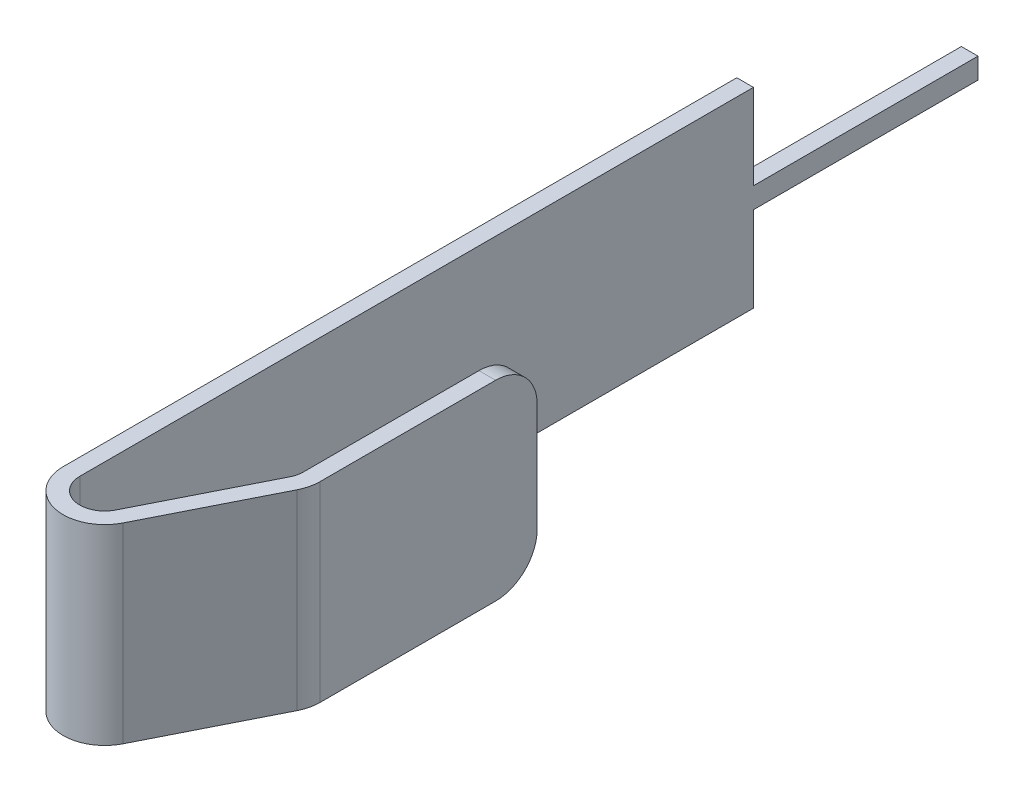
ISO-10303-21;
HEADER;
FILE_DESCRIPTION(('STEP AP214'),'2;1');
FILE_NAME('part.step','',(''),(''),'','','');
FILE_SCHEMA(('AUTOMOTIVE_DESIGN { 1 0 10303 214 1 1 1 1 }'));
ENDSEC;
DATA;
#1=APPLICATION_CONTEXT('core data for automotive mechanical design processes');
#2=APPLICATION_PROTOCOL_DEFINITION('international standard','automotive_design',2000,#1);
#3=PRODUCT_CONTEXT('',#1,'mechanical');
#4=PRODUCT('Part','Part','',(#3));
#5=PRODUCT_RELATED_PRODUCT_CATEGORY('part','',(#4));
#6=PRODUCT_DEFINITION_FORMATION('','',#4);
#7=PRODUCT_DEFINITION_CONTEXT('part definition',#1,'design');
#8=PRODUCT_DEFINITION('design','',#6,#7);
#9=PRODUCT_DEFINITION_SHAPE('','',#8);
#10=(LENGTH_UNIT() NAMED_UNIT(*) SI_UNIT(.MILLI.,.METRE.));
#11=(NAMED_UNIT(*) PLANE_ANGLE_UNIT() SI_UNIT($,.RADIAN.));
#12=(NAMED_UNIT(*) SI_UNIT($,.STERADIAN.) SOLID_ANGLE_UNIT());
#13=UNCERTAINTY_MEASURE_WITH_UNIT(LENGTH_MEASURE(1.E-05),#10,'distance_accuracy_value','');
#14=(GEOMETRIC_REPRESENTATION_CONTEXT(3) GLOBAL_UNCERTAINTY_ASSIGNED_CONTEXT((#13)) GLOBAL_UNIT_ASSIGNED_CONTEXT((#10,
#11,#12)) REPRESENTATION_CONTEXT('',''));
#15=CARTESIAN_POINT('',(0.,0.,0.));
#16=DIRECTION('',(0.,0.,1.));
#17=DIRECTION('',(1.,0.,0.));
#18=AXIS2_PLACEMENT_3D('',#15,#16,#17);
#19=CARTESIAN_POINT('',(0.,2.921,-6.858));
#20=DIRECTION('',(0.,0.,-1.));
#21=DIRECTION('',(-1.,0.,0.));
#22=AXIS2_PLACEMENT_3D('',#19,#20,#21);
#23=PLANE('',#22);
#24=DIRECTION('',(-1.,0.,0.));
#25=VECTOR('',#24,1.);
#26=CARTESIAN_POINT('',(4.31800000000001,-0.3175,-6.858));
#27=LINE('',#26,#25);
#28=CARTESIAN_POINT('',(0.508,-0.3175,-6.858));
#29=VERTEX_POINT('',#28);
#30=CARTESIAN_POINT('',(0.,-0.3175,-6.858));
#31=VERTEX_POINT('',#30);
#32=EDGE_CURVE('E354',#29,#31,#27,.T.);
#33=ORIENTED_EDGE('',*,*,#32,.T.);
#34=DIRECTION('',(0.,-1.,0.));
#35=VECTOR('',#34,1.);
#36=CARTESIAN_POINT('',(0.,2.921,-6.858));
#37=LINE('',#36,#35);
#38=CARTESIAN_POINT('',(0.,0.3175,-6.858));
#39=VERTEX_POINT('',#38);
#40=EDGE_CURVE('E236',#39,#31,#37,.T.);
#41=ORIENTED_EDGE('',*,*,#40,.F.);
#42=DIRECTION('',(-1.,0.,0.));
#43=VECTOR('',#42,1.);
#44=CARTESIAN_POINT('',(4.31800000000001,0.3175,-6.858));
#45=LINE('',#44,#43);
#46=CARTESIAN_POINT('',(0.508,0.3175,-6.858));
#47=VERTEX_POINT('',#46);
#48=EDGE_CURVE('E271',#47,#39,#45,.T.);
#49=ORIENTED_EDGE('',*,*,#48,.F.);
#50=DIRECTION('',(0.,-1.,0.));
#51=VECTOR('',#50,1.);
#52=CARTESIAN_POINT('',(0.508,2.921,-6.858));
#53=LINE('',#52,#51);
#54=EDGE_CURVE('E238',#47,#29,#53,.T.);
#55=ORIENTED_EDGE('',*,*,#54,.T.);
#56=EDGE_LOOP('',(#33,#41,#49,#55));
#57=FACE_BOUND('',#56,.T.);
#58=ADVANCED_FACE('F35',(#57),#23,.T.);
#59=CARTESIAN_POINT('',(0.,2.921,0.));
#60=DIRECTION('',(-1.,0.,0.));
#61=DIRECTION('',(0.,0.,1.));
#62=AXIS2_PLACEMENT_3D('',#59,#60,#61);
#63=PLANE('',#62);
#64=DIRECTION('',(0.,0.,-1.));
#65=VECTOR('',#64,1.);
#66=CARTESIAN_POINT('',(0.,-0.3175,-6.858));
#67=LINE('',#66,#65);
#68=CARTESIAN_POINT('',(0.,-0.3175,0.));
#69=VERTEX_POINT('',#68);
#70=EDGE_CURVE('E175',#69,#31,#67,.T.);
#71=ORIENTED_EDGE('',*,*,#70,.F.);
#72=DIRECTION('',(0.,1.,0.));
#73=VECTOR('',#72,1.);
#74=CARTESIAN_POINT('',(0.,-2.921,0.));
#75=LINE('',#74,#73);
#76=CARTESIAN_POINT('',(0.,-2.921,0.));
#77=VERTEX_POINT('',#76);
#78=EDGE_CURVE('E161',#77,#69,#75,.T.);
#79=ORIENTED_EDGE('',*,*,#78,.F.);
#80=DIRECTION('',(0.,0.,-1.));
#81=VECTOR('',#80,1.);
#82=CARTESIAN_POINT('',(0.,-2.921,0.));
#83=LINE('',#82,#81);
#84=CARTESIAN_POINT('',(0.,-2.921,20.574));
#85=VERTEX_POINT('',#84);
#86=EDGE_CURVE('E172',#85,#77,#83,.T.);
#87=ORIENTED_EDGE('',*,*,#86,.F.);
#88=DIRECTION('',(0.,-1.,0.));
#89=VECTOR('',#88,1.);
#90=CARTESIAN_POINT('',(0.,2.921,20.574));
#91=LINE('',#90,#89);
#92=CARTESIAN_POINT('',(0.,2.921,20.574));
#93=VERTEX_POINT('',#92);
#94=EDGE_CURVE('E234',#93,#85,#91,.T.);
#95=ORIENTED_EDGE('',*,*,#94,.F.);
#96=DIRECTION('',(0.,0.,-1.));
#97=VECTOR('',#96,1.);
#98=CARTESIAN_POINT('',(0.,2.921,0.));
#99=LINE('',#98,#97);
#100=CARTESIAN_POINT('',(0.,2.921,0.));
#101=VERTEX_POINT('',#100);
#102=EDGE_CURVE('E282',#93,#101,#99,.T.);
#103=ORIENTED_EDGE('',*,*,#102,.T.);
#104=DIRECTION('',(0.,1.,0.));
#105=VECTOR('',#104,1.);
#106=CARTESIAN_POINT('',(0.,2.921,0.));
#107=LINE('',#106,#105);
#108=CARTESIAN_POINT('',(0.,0.3175,0.));
#109=VERTEX_POINT('',#108);
#110=EDGE_CURVE('E58',#109,#101,#107,.T.);
#111=ORIENTED_EDGE('',*,*,#110,.F.);
#112=DIRECTION('',(0.,0.,1.));
#113=VECTOR('',#112,1.);
#114=CARTESIAN_POINT('',(0.,0.3175,-6.858));
#115=LINE('',#114,#113);
#116=EDGE_CURVE('E278',#39,#109,#115,.T.);
#117=ORIENTED_EDGE('',*,*,#116,.F.);
#118=ORIENTED_EDGE('',*,*,#40,.T.);
#119=EDGE_LOOP('',(#71,#79,#87,#95,#103,#111,#117,#118));
#120=FACE_BOUND('',#119,.T.);
#121=ADVANCED_FACE('F170',(#120),#63,.T.);
#122=CARTESIAN_POINT('',(1.27,2.921,20.574));
#123=DIRECTION('',(0.,-1.,0.));
#124=DIRECTION('',(0.,0.,-1.));
#125=AXIS2_PLACEMENT_3D('',#122,#123,#124);
#126=CYLINDRICAL_SURFACE('',#125,1.27);
#127=CARTESIAN_POINT('',(1.27,-2.921,20.574));
#128=DIRECTION('',(0.,-1.,0.));
#129=DIRECTION('',(0.,0.,-1.));
#130=AXIS2_PLACEMENT_3D('',#127,#128,#129);
#131=CIRCLE('',#130,1.27);
#132=CARTESIAN_POINT('',(2.40437020869445,-2.921,21.1450553647647));
#133=VERTEX_POINT('',#132);
#134=EDGE_CURVE('E180',#133,#85,#131,.T.);
#135=ORIENTED_EDGE('',*,*,#134,.F.);
#136=DIRECTION('',(0.,-1.,0.));
#137=VECTOR('',#136,1.);
#138=CARTESIAN_POINT('',(2.40437020869445,2.921,21.1450553647647));
#139=LINE('',#138,#137);
#140=CARTESIAN_POINT('',(2.40437020869445,2.921,21.1450553647647));
#141=VERTEX_POINT('',#140);
#142=EDGE_CURVE('E232',#141,#133,#139,.T.);
#143=ORIENTED_EDGE('',*,*,#142,.F.);
#144=CARTESIAN_POINT('',(1.27,2.921,20.574));
#145=DIRECTION('',(0.,-1.,0.));
#146=DIRECTION('',(0.,0.,-1.));
#147=AXIS2_PLACEMENT_3D('',#144,#145,#146);
#148=CIRCLE('',#147,1.27);
#149=EDGE_CURVE('E285',#141,#93,#148,.T.);
#150=ORIENTED_EDGE('',*,*,#149,.T.);
#151=ORIENTED_EDGE('',*,*,#94,.T.);
#152=EDGE_LOOP('',(#135,#143,#150,#151));
#153=FACE_BOUND('',#152,.T.);
#154=ADVANCED_FACE('F351',(#153),#126,.T.);
#155=CARTESIAN_POINT('',(2.40437020869445,2.921,21.1450553647647));
#156=DIRECTION('',(0.893204888735784,0.,0.449649893515495));
#157=DIRECTION('',(0.449649893515495,0.,-0.893204888735784));
#158=AXIS2_PLACEMENT_3D('',#155,#156,#157);
#159=PLANE('',#158);
#160=DIRECTION('',(-0.449649893515495,0.,0.893204888735784));
#161=VECTOR('',#160,1.);
#162=CARTESIAN_POINT('',(2.40437020869445,-2.921,21.1450553647647));
#163=LINE('',#162,#161);
#164=CARTESIAN_POINT('',(4.18237020869445,-2.921,17.6131557355757));
#165=VERTEX_POINT('',#164);
#166=EDGE_CURVE('E183',#165,#133,#163,.T.);
#167=ORIENTED_EDGE('',*,*,#166,.F.);
#168=DIRECTION('',(0.,-1.,0.));
#169=VECTOR('',#168,1.);
#170=CARTESIAN_POINT('',(4.18237020869445,2.921,17.6131557355757));
#171=LINE('',#170,#169);
#172=CARTESIAN_POINT('',(4.18237020869445,2.921,17.6131557355757));
#173=VERTEX_POINT('',#172);
#174=EDGE_CURVE('E230',#173,#165,#171,.T.);
#175=ORIENTED_EDGE('',*,*,#174,.F.);
#176=DIRECTION('',(-0.449649893515495,0.,0.893204888735784));
#177=VECTOR('',#176,1.);
#178=CARTESIAN_POINT('',(2.40437020869445,2.921,21.1450553647647));
#179=LINE('',#178,#177);
#180=EDGE_CURVE('E288',#173,#141,#179,.T.);
#181=ORIENTED_EDGE('',*,*,#180,.T.);
#182=ORIENTED_EDGE('',*,*,#142,.T.);
#183=EDGE_LOOP('',(#167,#175,#181,#182));
#184=FACE_BOUND('',#183,.T.);
#185=ADVANCED_FACE('F349',(#184),#159,.T.);
#186=CARTESIAN_POINT('',(3.04800000000001,2.921,17.0421003708111));
#187=DIRECTION('',(0.,-1.,0.));
#188=DIRECTION('',(0.,0.,-1.));
#189=AXIS2_PLACEMENT_3D('',#186,#187,#188);
#190=CYLINDRICAL_SURFACE('',#189,1.27);
#191=CARTESIAN_POINT('',(3.04800000000001,-2.921,17.0421003708111));
#192=DIRECTION('',(0.,-1.,0.));
#193=DIRECTION('',(0.,0.,-1.));
#194=AXIS2_PLACEMENT_3D('',#191,#192,#193);
#195=CIRCLE('',#194,1.27);
#196=CARTESIAN_POINT('',(4.31800000000001,-2.921,17.0421003708111));
#197=VERTEX_POINT('',#196);
#198=EDGE_CURVE('E193',#197,#165,#195,.T.);
#199=ORIENTED_EDGE('',*,*,#198,.F.);
#200=DIRECTION('',(0.,-1.,0.));
#201=VECTOR('',#200,1.);
#202=CARTESIAN_POINT('',(4.31800000000001,2.921,17.0421003708111));
#203=LINE('',#202,#201);
#204=CARTESIAN_POINT('',(4.31800000000001,2.921,17.0421003708111));
#205=VERTEX_POINT('',#204);
#206=EDGE_CURVE('E227',#205,#197,#203,.T.);
#207=ORIENTED_EDGE('',*,*,#206,.F.);
#208=CARTESIAN_POINT('',(3.04800000000001,2.921,17.0421003708111));
#209=DIRECTION('',(0.,-1.,0.));
#210=DIRECTION('',(0.,0.,-1.));
#211=AXIS2_PLACEMENT_3D('',#208,#209,#210);
#212=CIRCLE('',#211,1.27);
#213=EDGE_CURVE('E291',#205,#173,#212,.T.);
#214=ORIENTED_EDGE('',*,*,#213,.T.);
#215=ORIENTED_EDGE('',*,*,#174,.T.);
#216=EDGE_LOOP('',(#199,#207,#214,#215));
#217=FACE_BOUND('',#216,.T.);
#218=ADVANCED_FACE('F346',(#217),#190,.T.);
#219=CARTESIAN_POINT('',(4.31800000000001,2.921,17.0421003708111));
#220=DIRECTION('',(1.,0.,0.));
#221=DIRECTION('',(0.,0.,-1.));
#222=AXIS2_PLACEMENT_3D('',#219,#220,#221);
#223=PLANE('',#222);
#224=DIRECTION('',(0.,0.,1.));
#225=VECTOR('',#224,1.);
#226=CARTESIAN_POINT('',(4.31800000000001,-2.921,17.0421003708111));
#227=LINE('',#226,#225);
#228=CARTESIAN_POINT('',(4.31800000000001,-2.921,11.684));
#229=VERTEX_POINT('',#228);
#230=EDGE_CURVE('E196',#229,#197,#227,.T.);
#231=ORIENTED_EDGE('',*,*,#230,.F.);
#232=CARTESIAN_POINT('',(4.31800000000001,-1.651,11.684));
#233=DIRECTION('',(1.,0.,0.));
#234=DIRECTION('',(0.,0.,-1.));
#235=AXIS2_PLACEMENT_3D('',#232,#233,#234);
#236=CIRCLE('',#235,1.27);
#237=CARTESIAN_POINT('',(4.31800000000001,-1.651,10.414));
#238=VERTEX_POINT('',#237);
#239=EDGE_CURVE('E246',#229,#238,#236,.T.);
#240=ORIENTED_EDGE('',*,*,#239,.T.);
#241=DIRECTION('',(0.,-1.,0.));
#242=VECTOR('',#241,1.);
#243=CARTESIAN_POINT('',(4.31800000000001,2.921,10.414));
#244=LINE('',#243,#242);
#245=CARTESIAN_POINT('',(4.31800000000001,1.651,10.414));
#246=VERTEX_POINT('',#245);
#247=EDGE_CURVE('E224',#246,#238,#244,.T.);
#248=ORIENTED_EDGE('',*,*,#247,.F.);
#249=CARTESIAN_POINT('',(4.31800000000001,1.651,11.684));
#250=DIRECTION('',(1.,0.,0.));
#251=DIRECTION('',(0.,0.,-1.));
#252=AXIS2_PLACEMENT_3D('',#249,#250,#251);
#253=CIRCLE('',#252,1.27);
#254=CARTESIAN_POINT('',(4.31800000000001,2.921,11.684));
#255=VERTEX_POINT('',#254);
#256=EDGE_CURVE('E244',#246,#255,#253,.T.);
#257=ORIENTED_EDGE('',*,*,#256,.T.);
#258=DIRECTION('',(0.,0.,1.));
#259=VECTOR('',#258,1.);
#260=CARTESIAN_POINT('',(4.31800000000001,2.921,17.0421003708111));
#261=LINE('',#260,#259);
#262=EDGE_CURVE('E294',#255,#205,#261,.T.);
#263=ORIENTED_EDGE('',*,*,#262,.T.);
#264=ORIENTED_EDGE('',*,*,#206,.T.);
#265=EDGE_LOOP('',(#231,#240,#248,#257,#263,#264));
#266=FACE_BOUND('',#265,.T.);
#267=ADVANCED_FACE('F332',(#266),#223,.T.);
#268=CARTESIAN_POINT('',(3.81000000000001,2.921,10.414));
#269=DIRECTION('',(0.,0.,-1.));
#270=DIRECTION('',(-1.,0.,0.));
#271=AXIS2_PLACEMENT_3D('',#268,#269,#270);
#272=PLANE('',#271);
#273=ORIENTED_EDGE('',*,*,#247,.T.);
#274=DIRECTION('',(1.,0.,0.));
#275=VECTOR('',#274,1.);
#276=CARTESIAN_POINT('',(3.81000000000001,-1.651,10.414));
#277=LINE('',#276,#275);
#278=CARTESIAN_POINT('',(3.81000000000001,-1.651,10.414));
#279=VERTEX_POINT('',#278);
#280=EDGE_CURVE('E251',#238,#279,#277,.F.);
#281=ORIENTED_EDGE('',*,*,#280,.T.);
#282=DIRECTION('',(0.,-1.,0.));
#283=VECTOR('',#282,1.);
#284=CARTESIAN_POINT('',(3.81000000000001,2.921,10.414));
#285=LINE('',#284,#283);
#286=CARTESIAN_POINT('',(3.81000000000001,1.651,10.414));
#287=VERTEX_POINT('',#286);
#288=EDGE_CURVE('E221',#287,#279,#285,.T.);
#289=ORIENTED_EDGE('',*,*,#288,.F.);
#290=DIRECTION('',(1.,0.,0.));
#291=VECTOR('',#290,1.);
#292=CARTESIAN_POINT('',(4.31800000000001,1.651,10.414));
#293=LINE('',#292,#291);
#294=EDGE_CURVE('E248',#287,#246,#293,.T.);
#295=ORIENTED_EDGE('',*,*,#294,.T.);
#296=EDGE_LOOP('',(#273,#281,#289,#295));
#297=FACE_BOUND('',#296,.T.);
#298=ADVANCED_FACE('F334',(#297),#272,.T.);
#299=CARTESIAN_POINT('',(3.81000000000001,2.921,17.0421003708111));
#300=DIRECTION('',(1.,0.,0.));
#301=DIRECTION('',(0.,0.,-1.));
#302=AXIS2_PLACEMENT_3D('',#299,#300,#301);
#303=PLANE('',#302);
#304=ORIENTED_EDGE('',*,*,#288,.T.);
#305=CARTESIAN_POINT('',(3.81000000000001,-1.651,11.684));
#306=DIRECTION('',(1.,0.,0.));
#307=DIRECTION('',(0.,0.,-1.));
#308=AXIS2_PLACEMENT_3D('',#305,#306,#307);
#309=CIRCLE('',#308,1.27);
#310=CARTESIAN_POINT('',(3.81000000000001,-2.921,11.684));
#311=VERTEX_POINT('',#310);
#312=EDGE_CURVE('E255',#279,#311,#309,.F.);
#313=ORIENTED_EDGE('',*,*,#312,.T.);
#314=DIRECTION('',(0.,0.,-1.));
#315=VECTOR('',#314,1.);
#316=CARTESIAN_POINT('',(3.81000000000001,-2.921,17.0421003708111));
#317=LINE('',#316,#315);
#318=CARTESIAN_POINT('',(3.81000000000001,-2.921,17.0421003708111));
#319=VERTEX_POINT('',#318);
#320=EDGE_CURVE('E198',#311,#319,#317,.F.);
#321=ORIENTED_EDGE('',*,*,#320,.T.);
#322=DIRECTION('',(0.,-1.,0.));
#323=VECTOR('',#322,1.);
#324=CARTESIAN_POINT('',(3.81000000000001,2.921,17.0421003708111));
#325=LINE('',#324,#323);
#326=CARTESIAN_POINT('',(3.81000000000001,2.921,17.0421003708111));
#327=VERTEX_POINT('',#326);
#328=EDGE_CURVE('E218',#327,#319,#325,.T.);
#329=ORIENTED_EDGE('',*,*,#328,.F.);
#330=DIRECTION('',(0.,0.,-1.));
#331=VECTOR('',#330,1.);
#332=CARTESIAN_POINT('',(3.81000000000001,2.921,17.0421003708111));
#333=LINE('',#332,#331);
#334=CARTESIAN_POINT('',(3.81000000000001,2.921,11.684));
#335=VERTEX_POINT('',#334);
#336=EDGE_CURVE('E296',#335,#327,#333,.F.);
#337=ORIENTED_EDGE('',*,*,#336,.F.);
#338=CARTESIAN_POINT('',(3.81000000000001,1.651,11.684));
#339=DIRECTION('',(1.,0.,0.));
#340=DIRECTION('',(0.,0.,-1.));
#341=AXIS2_PLACEMENT_3D('',#338,#339,#340);
#342=CIRCLE('',#341,1.27);
#343=EDGE_CURVE('E253',#335,#287,#342,.F.);
#344=ORIENTED_EDGE('',*,*,#343,.T.);
#345=EDGE_LOOP('',(#304,#313,#321,#329,#337,#344));
#346=FACE_BOUND('',#345,.T.);
#347=ADVANCED_FACE('F322',(#346),#303,.F.);
#348=CARTESIAN_POINT('',(3.04800000000001,2.921,17.0421003708111));
#349=DIRECTION('',(0.,-1.,0.));
#350=DIRECTION('',(0.,0.,-1.));
#351=AXIS2_PLACEMENT_3D('',#348,#349,#350);
#352=CYLINDRICAL_SURFACE('',#351,0.761999999999999);
#353=CARTESIAN_POINT('',(3.04800000000001,-2.921,17.0421003708111));
#354=DIRECTION('',(0.,1.,0.));
#355=DIRECTION('',(1.,0.,0.));
#356=AXIS2_PLACEMENT_3D('',#353,#354,#355);
#357=CIRCLE('',#356,0.761999999999999);
#358=CARTESIAN_POINT('',(3.72862212521667,-2.921,17.3847335896699));
#359=VERTEX_POINT('',#358);
#360=EDGE_CURVE('E200',#319,#359,#357,.F.);
#361=ORIENTED_EDGE('',*,*,#360,.T.);
#362=DIRECTION('',(0.,-1.,0.));
#363=VECTOR('',#362,1.);
#364=CARTESIAN_POINT('',(3.72862212521667,2.921,17.3847335896699));
#365=LINE('',#364,#363);
#366=CARTESIAN_POINT('',(3.72862212521667,2.921,17.3847335896699));
#367=VERTEX_POINT('',#366);
#368=EDGE_CURVE('E215',#367,#359,#365,.T.);
#369=ORIENTED_EDGE('',*,*,#368,.F.);
#370=CARTESIAN_POINT('',(3.04800000000001,2.921,17.0421003708111));
#371=DIRECTION('',(0.,1.,0.));
#372=DIRECTION('',(1.,0.,0.));
#373=AXIS2_PLACEMENT_3D('',#370,#371,#372);
#374=CIRCLE('',#373,0.761999999999999);
#375=EDGE_CURVE('E298',#327,#367,#374,.F.);
#376=ORIENTED_EDGE('',*,*,#375,.F.);
#377=ORIENTED_EDGE('',*,*,#328,.T.);
#378=EDGE_LOOP('',(#361,#369,#376,#377));
#379=FACE_BOUND('',#378,.T.);
#380=ADVANCED_FACE('F318',(#379),#352,.F.);
#381=CARTESIAN_POINT('',(1.95062212521667,2.921,20.9166332188588));
#382=DIRECTION('',(0.893204888735784,0.,0.449649893515495));
#383=DIRECTION('',(0.449649893515495,0.,-0.893204888735784));
#384=AXIS2_PLACEMENT_3D('',#381,#382,#383);
#385=PLANE('',#384);
#386=DIRECTION('',(-0.449649893515495,0.,0.893204888735784));
#387=VECTOR('',#386,1.);
#388=CARTESIAN_POINT('',(1.95062212521667,-2.921,20.9166332188588));
#389=LINE('',#388,#387);
#390=CARTESIAN_POINT('',(1.95062212521667,-2.921,20.9166332188588));
#391=VERTEX_POINT('',#390);
#392=EDGE_CURVE('E202',#359,#391,#389,.T.);
#393=ORIENTED_EDGE('',*,*,#392,.T.);
#394=DIRECTION('',(0.,-1.,0.));
#395=VECTOR('',#394,1.);
#396=CARTESIAN_POINT('',(1.95062212521667,2.921,20.9166332188588));
#397=LINE('',#396,#395);
#398=CARTESIAN_POINT('',(1.95062212521667,2.921,20.9166332188588));
#399=VERTEX_POINT('',#398);
#400=EDGE_CURVE('E212',#399,#391,#397,.T.);
#401=ORIENTED_EDGE('',*,*,#400,.F.);
#402=DIRECTION('',(-0.449649893515495,0.,0.893204888735784));
#403=VECTOR('',#402,1.);
#404=CARTESIAN_POINT('',(1.95062212521667,2.921,20.9166332188588));
#405=LINE('',#404,#403);
#406=EDGE_CURVE('E299',#367,#399,#405,.T.);
#407=ORIENTED_EDGE('',*,*,#406,.F.);
#408=ORIENTED_EDGE('',*,*,#368,.T.);
#409=EDGE_LOOP('',(#393,#401,#407,#408));
#410=FACE_BOUND('',#409,.T.);
#411=ADVANCED_FACE('F314',(#410),#385,.F.);
#412=CARTESIAN_POINT('',(1.27,2.921,20.574));
#413=DIRECTION('',(0.,-1.,0.));
#414=DIRECTION('',(0.,0.,-1.));
#415=AXIS2_PLACEMENT_3D('',#412,#413,#414);
#416=CYLINDRICAL_SURFACE('',#415,0.762);
#417=CARTESIAN_POINT('',(1.27,-2.921,20.574));
#418=DIRECTION('',(0.,1.,0.));
#419=DIRECTION('',(1.,0.,0.));
#420=AXIS2_PLACEMENT_3D('',#417,#418,#419);
#421=CIRCLE('',#420,0.762);
#422=CARTESIAN_POINT('',(0.508000000000003,-2.921,20.574));
#423=VERTEX_POINT('',#422);
#424=EDGE_CURVE('E204',#391,#423,#421,.F.);
#425=ORIENTED_EDGE('',*,*,#424,.T.);
#426=DIRECTION('',(0.,-1.,0.));
#427=VECTOR('',#426,1.);
#428=CARTESIAN_POINT('',(0.508000000000003,2.921,20.574));
#429=LINE('',#428,#427);
#430=CARTESIAN_POINT('',(0.508000000000003,2.921,20.574));
#431=VERTEX_POINT('',#430);
#432=EDGE_CURVE('E209',#431,#423,#429,.T.);
#433=ORIENTED_EDGE('',*,*,#432,.F.);
#434=CARTESIAN_POINT('',(1.27,2.921,20.574));
#435=DIRECTION('',(0.,1.,0.));
#436=DIRECTION('',(1.,0.,0.));
#437=AXIS2_PLACEMENT_3D('',#434,#435,#436);
#438=CIRCLE('',#437,0.762);
#439=EDGE_CURVE('E189',#399,#431,#438,.F.);
#440=ORIENTED_EDGE('',*,*,#439,.F.);
#441=ORIENTED_EDGE('',*,*,#400,.T.);
#442=EDGE_LOOP('',(#425,#433,#440,#441));
#443=FACE_BOUND('',#442,.T.);
#444=ADVANCED_FACE('F308',(#443),#416,.F.);
#445=CARTESIAN_POINT('',(0.508,2.921,0.));
#446=DIRECTION('',(-1.,0.,0.));
#447=DIRECTION('',(0.,0.,1.));
#448=AXIS2_PLACEMENT_3D('',#445,#446,#447);
#449=PLANE('',#448);
#450=DIRECTION('',(0.,1.,0.));
#451=VECTOR('',#450,1.);
#452=CARTESIAN_POINT('',(0.508,2.921,0.));
#453=LINE('',#452,#451);
#454=CARTESIAN_POINT('',(0.508,-2.921,0.));
#455=VERTEX_POINT('',#454);
#456=CARTESIAN_POINT('',(0.508,-0.3175,0.));
#457=VERTEX_POINT('',#456);
#458=EDGE_CURVE('E50',#455,#457,#453,.T.);
#459=ORIENTED_EDGE('',*,*,#458,.T.);
#460=DIRECTION('',(0.,0.,-1.));
#461=VECTOR('',#460,1.);
#462=CARTESIAN_POINT('',(0.508,-0.3175,0.));
#463=LINE('',#462,#461);
#464=EDGE_CURVE('E11',#457,#29,#463,.T.);
#465=ORIENTED_EDGE('',*,*,#464,.T.);
#466=ORIENTED_EDGE('',*,*,#54,.F.);
#467=DIRECTION('',(0.,0.,1.));
#468=VECTOR('',#467,1.);
#469=CARTESIAN_POINT('',(0.508,0.3175,0.));
#470=LINE('',#469,#468);
#471=CARTESIAN_POINT('',(0.508,0.3175,0.));
#472=VERTEX_POINT('',#471);
#473=EDGE_CURVE('E167',#47,#472,#470,.T.);
#474=ORIENTED_EDGE('',*,*,#473,.T.);
#475=DIRECTION('',(0.,1.,0.));
#476=VECTOR('',#475,1.);
#477=CARTESIAN_POINT('',(0.508,2.921,0.));
#478=LINE('',#477,#476);
#479=CARTESIAN_POINT('',(0.508000000000002,2.921,0.));
#480=VERTEX_POINT('',#479);
#481=EDGE_CURVE('E181',#472,#480,#478,.T.);
#482=ORIENTED_EDGE('',*,*,#481,.T.);
#483=DIRECTION('',(0.,0.,-1.));
#484=VECTOR('',#483,1.);
#485=CARTESIAN_POINT('',(0.508,2.921,0.));
#486=LINE('',#485,#484);
#487=EDGE_CURVE('E208',#431,#480,#486,.T.);
#488=ORIENTED_EDGE('',*,*,#487,.F.);
#489=ORIENTED_EDGE('',*,*,#432,.T.);
#490=DIRECTION('',(0.,0.,-1.));
#491=VECTOR('',#490,1.);
#492=CARTESIAN_POINT('',(0.508,-2.921,0.));
#493=LINE('',#492,#491);
#494=EDGE_CURVE('E206',#423,#455,#493,.T.);
#495=ORIENTED_EDGE('',*,*,#494,.T.);
#496=EDGE_LOOP('',(#459,#465,#466,#474,#482,#488,#489,#495));
#497=FACE_BOUND('',#496,.T.);
#498=ADVANCED_FACE('F264',(#497),#449,.F.);
#499=CARTESIAN_POINT('',(1.27,2.921,20.574));
#500=DIRECTION('',(0.,-1.,0.));
#501=DIRECTION('',(-1.,0.,0.));
#502=AXIS2_PLACEMENT_3D('',#499,#500,#501);
#503=PLANE('',#502);
#504=ORIENTED_EDGE('',*,*,#487,.T.);
#505=DIRECTION('',(-1.,0.,0.));
#506=VECTOR('',#505,1.);
#507=CARTESIAN_POINT('',(1.27,2.921,0.));
#508=LINE('',#507,#506);
#509=EDGE_CURVE('E259',#480,#101,#508,.T.);
#510=ORIENTED_EDGE('',*,*,#509,.T.);
#511=ORIENTED_EDGE('',*,*,#102,.F.);
#512=ORIENTED_EDGE('',*,*,#149,.F.);
#513=ORIENTED_EDGE('',*,*,#180,.F.);
#514=ORIENTED_EDGE('',*,*,#213,.F.);
#515=ORIENTED_EDGE('',*,*,#262,.F.);
#516=DIRECTION('',(1.,0.,0.));
#517=VECTOR('',#516,1.);
#518=CARTESIAN_POINT('',(3.81000000000001,2.921,11.684));
#519=LINE('',#518,#517);
#520=EDGE_CURVE('E257',#255,#335,#519,.F.);
#521=ORIENTED_EDGE('',*,*,#520,.T.);
#522=ORIENTED_EDGE('',*,*,#336,.T.);
#523=ORIENTED_EDGE('',*,*,#375,.T.);
#524=ORIENTED_EDGE('',*,*,#406,.T.);
#525=ORIENTED_EDGE('',*,*,#439,.T.);
#526=EDGE_LOOP('',(#504,#510,#511,#512,#513,#514,#515,#521,#522,#523,#524,#525));
#527=FACE_BOUND('',#526,.T.);
#528=ADVANCED_FACE('F306',(#527),#503,.F.);
#529=CARTESIAN_POINT('',(1.27,-2.921,20.574));
#530=DIRECTION('',(0.,-1.,0.));
#531=DIRECTION('',(-1.,0.,0.));
#532=AXIS2_PLACEMENT_3D('',#529,#530,#531);
#533=PLANE('',#532);
#534=DIRECTION('',(-1.,0.,0.));
#535=VECTOR('',#534,1.);
#536=CARTESIAN_POINT('',(1.27,-2.921,0.));
#537=LINE('',#536,#535);
#538=EDGE_CURVE('E43',#455,#77,#537,.T.);
#539=ORIENTED_EDGE('',*,*,#538,.F.);
#540=ORIENTED_EDGE('',*,*,#494,.F.);
#541=ORIENTED_EDGE('',*,*,#424,.F.);
#542=ORIENTED_EDGE('',*,*,#392,.F.);
#543=ORIENTED_EDGE('',*,*,#360,.F.);
#544=ORIENTED_EDGE('',*,*,#320,.F.);
#545=DIRECTION('',(1.,0.,0.));
#546=VECTOR('',#545,1.);
#547=CARTESIAN_POINT('',(1.27,-2.921,11.684));
#548=LINE('',#547,#546);
#549=EDGE_CURVE('E241',#311,#229,#548,.T.);
#550=ORIENTED_EDGE('',*,*,#549,.T.);
#551=ORIENTED_EDGE('',*,*,#230,.T.);
#552=ORIENTED_EDGE('',*,*,#198,.T.);
#553=ORIENTED_EDGE('',*,*,#166,.T.);
#554=ORIENTED_EDGE('',*,*,#134,.T.);
#555=ORIENTED_EDGE('',*,*,#86,.T.);
#556=EDGE_LOOP('',(#539,#540,#541,#542,#543,#544,#550,#551,#552,#553,#554,#555));
#557=FACE_BOUND('',#556,.T.);
#558=ADVANCED_FACE('F177',(#557),#533,.T.);
#559=CARTESIAN_POINT('',(1.27,-1.651,11.684));
#560=DIRECTION('',(1.,0.,0.));
#561=DIRECTION('',(0.,0.,-1.));
#562=AXIS2_PLACEMENT_3D('',#559,#560,#561);
#563=CYLINDRICAL_SURFACE('',#562,1.27);
#564=ORIENTED_EDGE('',*,*,#312,.F.);
#565=ORIENTED_EDGE('',*,*,#280,.F.);
#566=ORIENTED_EDGE('',*,*,#239,.F.);
#567=ORIENTED_EDGE('',*,*,#549,.F.);
#568=EDGE_LOOP('',(#564,#565,#566,#567));
#569=FACE_BOUND('',#568,.T.);
#570=ADVANCED_FACE('F328',(#569),#563,.T.);
#571=CARTESIAN_POINT('',(3.81000000000001,1.651,11.684));
#572=DIRECTION('',(-1.,0.,0.));
#573=DIRECTION('',(0.,0.,1.));
#574=AXIS2_PLACEMENT_3D('',#571,#572,#573);
#575=CYLINDRICAL_SURFACE('',#574,1.27);
#576=ORIENTED_EDGE('',*,*,#343,.F.);
#577=ORIENTED_EDGE('',*,*,#520,.F.);
#578=ORIENTED_EDGE('',*,*,#256,.F.);
#579=ORIENTED_EDGE('',*,*,#294,.F.);
#580=EDGE_LOOP('',(#576,#577,#578,#579));
#581=FACE_BOUND('',#580,.T.);
#582=ADVANCED_FACE('F37',(#581),#575,.T.);
#583=CARTESIAN_POINT('',(4.31800000000001,0.3175,-6.858));
#584=DIRECTION('',(0.,-1.,0.));
#585=DIRECTION('',(0.,0.,-1.));
#586=AXIS2_PLACEMENT_3D('',#583,#584,#585);
#587=PLANE('',#586);
#588=ORIENTED_EDGE('',*,*,#48,.T.);
#589=ORIENTED_EDGE('',*,*,#116,.T.);
#590=DIRECTION('',(-1.,0.,0.));
#591=VECTOR('',#590,1.);
#592=CARTESIAN_POINT('',(4.31800000000001,0.3175,0.));
#593=LINE('',#592,#591);
#594=EDGE_CURVE('E186',#472,#109,#593,.T.);
#595=ORIENTED_EDGE('',*,*,#594,.F.);
#596=ORIENTED_EDGE('',*,*,#473,.F.);
#597=EDGE_LOOP('',(#588,#589,#595,#596));
#598=FACE_BOUND('',#597,.T.);
#599=ADVANCED_FACE('F269',(#598),#587,.F.);
#600=CARTESIAN_POINT('',(4.31800000000001,2.921,0.));
#601=DIRECTION('',(0.,0.,1.));
#602=DIRECTION('',(1.,0.,0.));
#603=AXIS2_PLACEMENT_3D('',#600,#601,#602);
#604=PLANE('',#603);
#605=ORIENTED_EDGE('',*,*,#594,.T.);
#606=ORIENTED_EDGE('',*,*,#110,.T.);
#607=ORIENTED_EDGE('',*,*,#509,.F.);
#608=ORIENTED_EDGE('',*,*,#481,.F.);
#609=EDGE_LOOP('',(#605,#606,#607,#608));
#610=FACE_BOUND('',#609,.T.);
#611=ADVANCED_FACE('F352',(#610),#604,.F.);
#612=CARTESIAN_POINT('',(4.31800000000001,-0.3175,-6.858));
#613=DIRECTION('',(0.,1.,0.));
#614=DIRECTION('',(0.,0.,1.));
#615=AXIS2_PLACEMENT_3D('',#612,#613,#614);
#616=PLANE('',#615);
#617=DIRECTION('',(-1.,0.,0.));
#618=VECTOR('',#617,1.);
#619=CARTESIAN_POINT('',(4.31800000000001,-0.3175,0.));
#620=LINE('',#619,#618);
#621=EDGE_CURVE('E357',#457,#69,#620,.T.);
#622=ORIENTED_EDGE('',*,*,#621,.T.);
#623=ORIENTED_EDGE('',*,*,#70,.T.);
#624=ORIENTED_EDGE('',*,*,#32,.F.);
#625=ORIENTED_EDGE('',*,*,#464,.F.);
#626=EDGE_LOOP('',(#622,#623,#624,#625));
#627=FACE_BOUND('',#626,.T.);
#628=ADVANCED_FACE('F361',(#627),#616,.F.);
#629=CARTESIAN_POINT('',(4.31800000000001,-2.921,0.));
#630=DIRECTION('',(0.,0.,1.));
#631=DIRECTION('',(1.,0.,0.));
#632=AXIS2_PLACEMENT_3D('',#629,#630,#631);
#633=PLANE('',#632);
#634=ORIENTED_EDGE('',*,*,#538,.T.);
#635=ORIENTED_EDGE('',*,*,#78,.T.);
#636=ORIENTED_EDGE('',*,*,#621,.F.);
#637=ORIENTED_EDGE('',*,*,#458,.F.);
#638=EDGE_LOOP('',(#634,#635,#636,#637));
#639=FACE_BOUND('',#638,.T.);
#640=ADVANCED_FACE('F160',(#639),#633,.F.);
#641=CLOSED_SHELL('',(#58,#121,#154,#185,#218,#267,#298,#347,#380,#411,#444,#498,#528,#558,#570,
#582,#599,#611,#628,#640));
#642=MANIFOLD_SOLID_BREP('B2',#641);
#643=ADVANCED_BREP_SHAPE_REPRESENTATION('',(#18,#642),#14);
#644=SHAPE_DEFINITION_REPRESENTATION(#9,#643);
ENDSEC;
END-ISO-10303-21;
